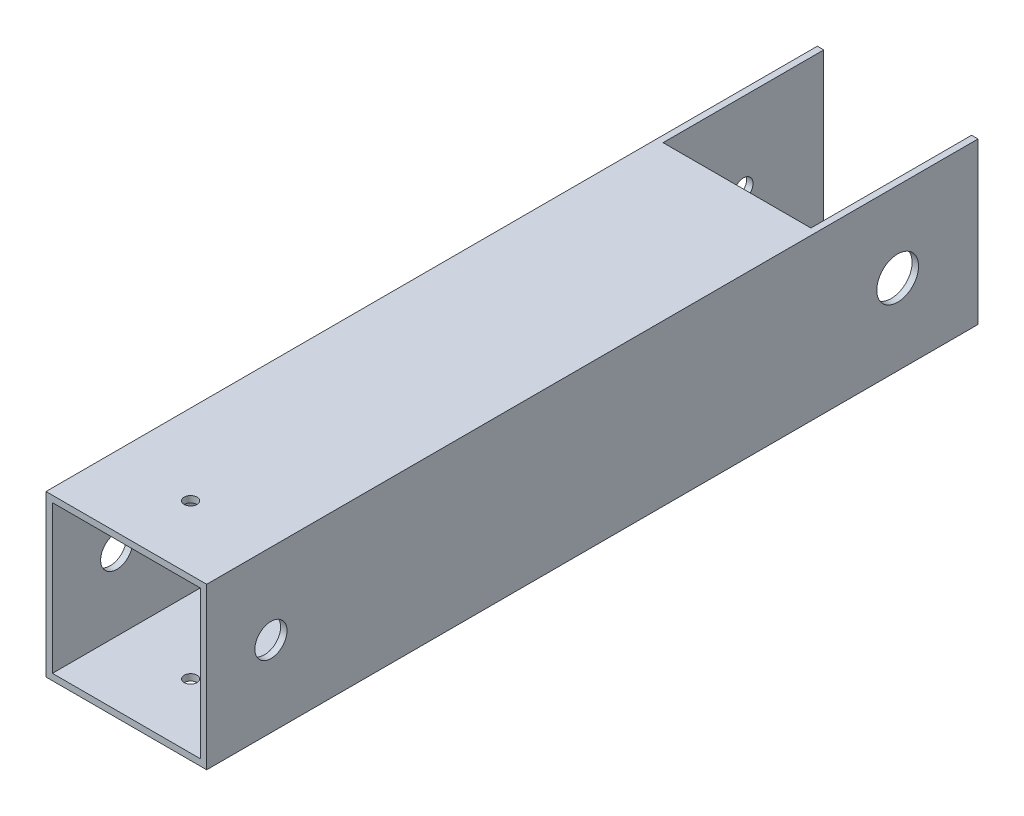
ISO-10303-21;
HEADER;
FILE_DESCRIPTION(('STEP AP214'),'2;1');
FILE_NAME('part.step','',(''),(''),'','','');
FILE_SCHEMA(('AUTOMOTIVE_DESIGN { 1 0 10303 214 1 1 1 1 }'));
ENDSEC;
DATA;
#1=APPLICATION_CONTEXT('core data for automotive mechanical design processes');
#2=APPLICATION_PROTOCOL_DEFINITION('international standard','automotive_design',2000,#1);
#3=PRODUCT_CONTEXT('',#1,'mechanical');
#4=PRODUCT('Part','Part','',(#3));
#5=PRODUCT_RELATED_PRODUCT_CATEGORY('part','',(#4));
#6=PRODUCT_DEFINITION_FORMATION('','',#4);
#7=PRODUCT_DEFINITION_CONTEXT('part definition',#1,'design');
#8=PRODUCT_DEFINITION('design','',#6,#7);
#9=PRODUCT_DEFINITION_SHAPE('','',#8);
#10=(LENGTH_UNIT() NAMED_UNIT(*) SI_UNIT(.MILLI.,.METRE.));
#11=(NAMED_UNIT(*) PLANE_ANGLE_UNIT() SI_UNIT($,.RADIAN.));
#12=(NAMED_UNIT(*) SI_UNIT($,.STERADIAN.) SOLID_ANGLE_UNIT());
#13=UNCERTAINTY_MEASURE_WITH_UNIT(LENGTH_MEASURE(1.E-05),#10,'distance_accuracy_value','');
#14=(GEOMETRIC_REPRESENTATION_CONTEXT(3) GLOBAL_UNCERTAINTY_ASSIGNED_CONTEXT((#13)) GLOBAL_UNIT_ASSIGNED_CONTEXT((#10,
#11,#12)) REPRESENTATION_CONTEXT('',''));
#15=CARTESIAN_POINT('',(0.,0.,0.));
#16=DIRECTION('',(0.,0.,1.));
#17=DIRECTION('',(1.,0.,0.));
#18=AXIS2_PLACEMENT_3D('',#15,#16,#17);
#19=CARTESIAN_POINT('',(-25.,-25.0000000000001,-240.));
#20=DIRECTION('',(-1.,0.,0.));
#21=DIRECTION('',(0.,0.,1.));
#22=AXIS2_PLACEMENT_3D('',#19,#20,#21);
#23=PLANE('',#22);
#24=CARTESIAN_POINT('',(-25.,0.,-215.));
#25=DIRECTION('',(-1.,0.,0.));
#26=DIRECTION('',(0.,0.,1.));
#27=AXIS2_PLACEMENT_3D('',#24,#25,#26);
#28=CIRCLE('',#27,2.99999999999999);
#29=CARTESIAN_POINT('',(-25.,0.,-212.));
#30=VERTEX_POINT('',#29);
#31=EDGE_CURVE('E187',#30,#30,#28,.T.);
#32=ORIENTED_EDGE('',*,*,#31,.F.);
#33=EDGE_LOOP('',(#32));
#34=FACE_BOUND('',#33,.T.);
#35=CARTESIAN_POINT('',(-25.,0.,-20.));
#36=DIRECTION('',(-1.,0.,0.));
#37=DIRECTION('',(0.,0.,1.));
#38=AXIS2_PLACEMENT_3D('',#35,#36,#37);
#39=CIRCLE('',#38,5.);
#40=CARTESIAN_POINT('',(-25.,0.,-15.));
#41=VERTEX_POINT('',#40);
#42=EDGE_CURVE('E186',#41,#41,#39,.T.);
#43=ORIENTED_EDGE('',*,*,#42,.F.);
#44=EDGE_LOOP('',(#43));
#45=FACE_BOUND('',#44,.T.);
#46=DIRECTION('',(0.,-1.,0.));
#47=VECTOR('',#46,1.);
#48=CARTESIAN_POINT('',(-25.,-25.0000000000001,0.));
#49=LINE('',#48,#47);
#50=CARTESIAN_POINT('',(-25.,25.0000000000001,0.));
#51=VERTEX_POINT('',#50);
#52=CARTESIAN_POINT('',(-25.,-25.0000000000001,0.));
#53=VERTEX_POINT('',#52);
#54=EDGE_CURVE('E286',#51,#53,#49,.T.);
#55=ORIENTED_EDGE('',*,*,#54,.F.);
#56=DIRECTION('',(0.,0.,1.));
#57=VECTOR('',#56,1.);
#58=CARTESIAN_POINT('',(-25.,25.0000000000001,-240.));
#59=LINE('',#58,#57);
#60=CARTESIAN_POINT('',(-25.,25.0000000000001,-240.));
#61=VERTEX_POINT('',#60);
#62=EDGE_CURVE('E294',#61,#51,#59,.T.);
#63=ORIENTED_EDGE('',*,*,#62,.F.);
#64=DIRECTION('',(0.,-1.,0.));
#65=VECTOR('',#64,1.);
#66=CARTESIAN_POINT('',(-25.,-25.0000000000001,-240.));
#67=LINE('',#66,#65);
#68=CARTESIAN_POINT('',(-25.,-25.0000000000001,-240.));
#69=VERTEX_POINT('',#68);
#70=EDGE_CURVE('E273',#61,#69,#67,.T.);
#71=ORIENTED_EDGE('',*,*,#70,.T.);
#72=DIRECTION('',(0.,0.,1.));
#73=VECTOR('',#72,1.);
#74=CARTESIAN_POINT('',(-25.,-25.0000000000001,-240.));
#75=LINE('',#74,#73);
#76=EDGE_CURVE('E292',#69,#53,#75,.T.);
#77=ORIENTED_EDGE('',*,*,#76,.T.);
#78=EDGE_LOOP('',(#55,#63,#71,#77));
#79=FACE_BOUND('',#78,.T.);
#80=DIRECTION('',(0.,1.,0.));
#81=VECTOR('',#80,1.);
#82=CARTESIAN_POINT('',(-25.,-23.0000000000001,-175.));
#83=LINE('',#82,#81);
#84=CARTESIAN_POINT('',(-25.,-23.0000000000001,-175.));
#85=VERTEX_POINT('',#84);
#86=CARTESIAN_POINT('',(-25.,23.0000000000001,-175.));
#87=VERTEX_POINT('',#86);
#88=EDGE_CURVE('E170',#85,#87,#83,.T.);
#89=ORIENTED_EDGE('',*,*,#88,.T.);
#90=DIRECTION('',(0.,0.,1.));
#91=VECTOR('',#90,1.);
#92=CARTESIAN_POINT('',(-25.,23.0000000000001,-175.));
#93=LINE('',#92,#91);
#94=CARTESIAN_POINT('',(-25.,23.,-55.));
#95=VERTEX_POINT('',#94);
#96=EDGE_CURVE('E53',#87,#95,#93,.T.);
#97=ORIENTED_EDGE('',*,*,#96,.T.);
#98=DIRECTION('',(0.,-1.,0.));
#99=VECTOR('',#98,1.);
#100=CARTESIAN_POINT('',(-25.,23.,-55.));
#101=LINE('',#100,#99);
#102=CARTESIAN_POINT('',(-25.,-23.0000000000001,-55.));
#103=VERTEX_POINT('',#102);
#104=EDGE_CURVE('E161',#95,#103,#101,.T.);
#105=ORIENTED_EDGE('',*,*,#104,.T.);
#106=DIRECTION('',(0.,0.,-1.));
#107=VECTOR('',#106,1.);
#108=CARTESIAN_POINT('',(-25.,-23.0000000000001,-55.));
#109=LINE('',#108,#107);
#110=EDGE_CURVE('E167',#103,#85,#109,.T.);
#111=ORIENTED_EDGE('',*,*,#110,.T.);
#112=EDGE_LOOP('',(#89,#97,#105,#111));
#113=FACE_BOUND('',#112,.T.);
#114=ADVANCED_FACE('F37',(#34,#45,#79,#113),#23,.T.);
#115=CARTESIAN_POINT('',(-23.,-23.0000000000001,-240.));
#116=DIRECTION('',(-1.,0.,0.));
#117=DIRECTION('',(0.,0.,1.));
#118=AXIS2_PLACEMENT_3D('',#115,#116,#117);
#119=PLANE('',#118);
#120=CARTESIAN_POINT('',(-23.,0.,-20.));
#121=DIRECTION('',(-1.,0.,0.));
#122=DIRECTION('',(0.,0.,1.));
#123=AXIS2_PLACEMENT_3D('',#120,#121,#122);
#124=CIRCLE('',#123,5.);
#125=CARTESIAN_POINT('',(-23.,0.,-15.));
#126=VERTEX_POINT('',#125);
#127=EDGE_CURVE('E191',#126,#126,#124,.F.);
#128=ORIENTED_EDGE('',*,*,#127,.F.);
#129=EDGE_LOOP('',(#128));
#130=FACE_BOUND('',#129,.T.);
#131=DIRECTION('',(0.,-1.,0.));
#132=VECTOR('',#131,1.);
#133=CARTESIAN_POINT('',(-23.,-23.0000000000002,-55.));
#134=LINE('',#133,#132);
#135=CARTESIAN_POINT('',(-23.,23.,-55.));
#136=VERTEX_POINT('',#135);
#137=CARTESIAN_POINT('',(-23.,-23.0000000000001,-55.));
#138=VERTEX_POINT('',#137);
#139=EDGE_CURVE('E184',#136,#138,#134,.T.);
#140=ORIENTED_EDGE('',*,*,#139,.F.);
#141=DIRECTION('',(0.,0.,1.));
#142=VECTOR('',#141,1.);
#143=CARTESIAN_POINT('',(-23.,23.0000000000001,-240.));
#144=LINE('',#143,#142);
#145=CARTESIAN_POINT('',(-23.,23.0000000000001,0.));
#146=VERTEX_POINT('',#145);
#147=EDGE_CURVE('E154',#136,#146,#144,.T.);
#148=ORIENTED_EDGE('',*,*,#147,.T.);
#149=DIRECTION('',(0.,-1.,0.));
#150=VECTOR('',#149,1.);
#151=CARTESIAN_POINT('',(-23.,-23.0000000000001,0.));
#152=LINE('',#151,#150);
#153=CARTESIAN_POINT('',(-23.,-23.0000000000001,0.));
#154=VERTEX_POINT('',#153);
#155=EDGE_CURVE('E249',#146,#154,#152,.T.);
#156=ORIENTED_EDGE('',*,*,#155,.T.);
#157=DIRECTION('',(0.,0.,1.));
#158=VECTOR('',#157,1.);
#159=CARTESIAN_POINT('',(-23.,-23.0000000000001,-240.));
#160=LINE('',#159,#158);
#161=EDGE_CURVE('E260',#138,#154,#160,.T.);
#162=ORIENTED_EDGE('',*,*,#161,.F.);
#163=EDGE_LOOP('',(#140,#148,#156,#162));
#164=FACE_BOUND('',#163,.T.);
#165=ADVANCED_FACE('F336',(#130,#164),#119,.F.);
#166=CARTESIAN_POINT('',(-23.,0.,-215.));
#167=DIRECTION('',(-1.,0.,0.));
#168=DIRECTION('',(0.,0.,1.));
#169=AXIS2_PLACEMENT_3D('',#166,#167,#168);
#170=CIRCLE('',#169,2.99999999999999);
#171=CARTESIAN_POINT('',(-23.,0.,-212.));
#172=VERTEX_POINT('',#171);
#173=EDGE_CURVE('E190',#172,#172,#170,.F.);
#174=ORIENTED_EDGE('',*,*,#173,.F.);
#175=EDGE_LOOP('',(#174));
#176=FACE_BOUND('',#175,.T.);
#177=DIRECTION('',(0.,1.,0.));
#178=VECTOR('',#177,1.);
#179=CARTESIAN_POINT('',(-23.,-23.0000000000001,-175.));
#180=LINE('',#179,#178);
#181=CARTESIAN_POINT('',(-23.,-23.0000000000001,-175.));
#182=VERTEX_POINT('',#181);
#183=CARTESIAN_POINT('',(-23.,23.0000000000001,-175.));
#184=VERTEX_POINT('',#183);
#185=EDGE_CURVE('E157',#182,#184,#180,.T.);
#186=ORIENTED_EDGE('',*,*,#185,.F.);
#187=CARTESIAN_POINT('',(-23.,-23.0000000000001,-190.));
#188=VERTEX_POINT('',#187);
#189=EDGE_CURVE('E257',#188,#182,#160,.T.);
#190=ORIENTED_EDGE('',*,*,#189,.F.);
#191=DIRECTION('',(0.,1.,0.));
#192=VECTOR('',#191,1.);
#193=CARTESIAN_POINT('',(-23.,-25.0000000000001,-190.));
#194=LINE('',#193,#192);
#195=CARTESIAN_POINT('',(-23.,-25.0000000000001,-190.));
#196=VERTEX_POINT('',#195);
#197=EDGE_CURVE('E234',#196,#188,#194,.T.);
#198=ORIENTED_EDGE('',*,*,#197,.F.);
#199=DIRECTION('',(0.,0.,1.));
#200=VECTOR('',#199,1.);
#201=CARTESIAN_POINT('',(-23.,-25.0000000000001,-190.));
#202=LINE('',#201,#200);
#203=CARTESIAN_POINT('',(-23.,-25.0000000000001,-240.));
#204=VERTEX_POINT('',#203);
#205=EDGE_CURVE('E211',#204,#196,#202,.T.);
#206=ORIENTED_EDGE('',*,*,#205,.F.);
#207=DIRECTION('',(0.,-1.,0.));
#208=VECTOR('',#207,1.);
#209=CARTESIAN_POINT('',(-23.,-23.0000000000001,-240.));
#210=LINE('',#209,#208);
#211=CARTESIAN_POINT('',(-23.,25.0000000000001,-240.));
#212=VERTEX_POINT('',#211);
#213=EDGE_CURVE('E241',#212,#204,#210,.T.);
#214=ORIENTED_EDGE('',*,*,#213,.F.);
#215=DIRECTION('',(0.,0.,1.));
#216=VECTOR('',#215,1.);
#217=CARTESIAN_POINT('',(-23.,25.0000000000001,-190.));
#218=LINE('',#217,#216);
#219=CARTESIAN_POINT('',(-23.,25.0000000000001,-190.));
#220=VERTEX_POINT('',#219);
#221=EDGE_CURVE('E206',#212,#220,#218,.T.);
#222=ORIENTED_EDGE('',*,*,#221,.T.);
#223=CARTESIAN_POINT('',(-23.,23.0000000000001,-190.));
#224=VERTEX_POINT('',#223);
#225=EDGE_CURVE('E221',#224,#220,#194,.T.);
#226=ORIENTED_EDGE('',*,*,#225,.F.);
#227=EDGE_CURVE('E261',#224,#184,#144,.T.);
#228=ORIENTED_EDGE('',*,*,#227,.T.);
#229=EDGE_LOOP('',(#186,#190,#198,#206,#214,#222,#226,#228));
#230=FACE_BOUND('',#229,.T.);
#231=ADVANCED_FACE('F327',(#176,#230),#119,.F.);
#232=CARTESIAN_POINT('',(0.,0.,-240.));
#233=DIRECTION('',(0.,0.,-1.));
#234=DIRECTION('',(-1.,0.,0.));
#235=AXIS2_PLACEMENT_3D('',#232,#233,#234);
#236=PLANE('',#235);
#237=ORIENTED_EDGE('',*,*,#213,.T.);
#238=DIRECTION('',(1.,0.,0.));
#239=VECTOR('',#238,1.);
#240=CARTESIAN_POINT('',(-25.,-25.0000000000001,-240.));
#241=LINE('',#240,#239);
#242=EDGE_CURVE('E277',#69,#204,#241,.T.);
#243=ORIENTED_EDGE('',*,*,#242,.F.);
#244=ORIENTED_EDGE('',*,*,#70,.F.);
#245=DIRECTION('',(-1.,0.,0.));
#246=VECTOR('',#245,1.);
#247=CARTESIAN_POINT('',(-25.,25.0000000000001,-240.));
#248=LINE('',#247,#246);
#249=EDGE_CURVE('E268',#212,#61,#248,.T.);
#250=ORIENTED_EDGE('',*,*,#249,.F.);
#251=EDGE_LOOP('',(#237,#243,#244,#250));
#252=FACE_BOUND('',#251,.T.);
#253=ADVANCED_FACE('F332',(#252),#236,.T.);
#254=CARTESIAN_POINT('',(25.,-25.0000000000001,-240.));
#255=DIRECTION('',(1.,0.,0.));
#256=DIRECTION('',(0.,0.,-1.));
#257=AXIS2_PLACEMENT_3D('',#254,#255,#256);
#258=PLANE('',#257);
#259=CARTESIAN_POINT('',(25.,0.,-215.));
#260=DIRECTION('',(1.,0.,0.));
#261=DIRECTION('',(0.,0.,-1.));
#262=AXIS2_PLACEMENT_3D('',#259,#260,#261);
#263=CIRCLE('',#262,6.50000000000002);
#264=CARTESIAN_POINT('',(25.,0.,-221.5));
#265=VERTEX_POINT('',#264);
#266=EDGE_CURVE('E199',#265,#265,#263,.T.);
#267=ORIENTED_EDGE('',*,*,#266,.F.);
#268=EDGE_LOOP('',(#267));
#269=FACE_BOUND('',#268,.T.);
#270=CARTESIAN_POINT('',(25.,0.,-20.));
#271=DIRECTION('',(1.,0.,0.));
#272=DIRECTION('',(0.,0.,-1.));
#273=AXIS2_PLACEMENT_3D('',#270,#271,#272);
#274=CIRCLE('',#273,5.);
#275=CARTESIAN_POINT('',(25.,0.,-25.));
#276=VERTEX_POINT('',#275);
#277=EDGE_CURVE('E194',#276,#276,#274,.T.);
#278=ORIENTED_EDGE('',*,*,#277,.F.);
#279=EDGE_LOOP('',(#278));
#280=FACE_BOUND('',#279,.T.);
#281=DIRECTION('',(0.,1.,0.));
#282=VECTOR('',#281,1.);
#283=CARTESIAN_POINT('',(25.,-25.0000000000001,0.));
#284=LINE('',#283,#282);
#285=CARTESIAN_POINT('',(25.,-25.0000000000001,0.));
#286=VERTEX_POINT('',#285);
#287=CARTESIAN_POINT('',(25.,25.0000000000001,0.));
#288=VERTEX_POINT('',#287);
#289=EDGE_CURVE('E256',#286,#288,#284,.T.);
#290=ORIENTED_EDGE('',*,*,#289,.F.);
#291=DIRECTION('',(0.,0.,1.));
#292=VECTOR('',#291,1.);
#293=CARTESIAN_POINT('',(25.,-25.0000000000001,-240.));
#294=LINE('',#293,#292);
#295=CARTESIAN_POINT('',(25.,-25.0000000000001,-240.));
#296=VERTEX_POINT('',#295);
#297=EDGE_CURVE('E46',#296,#286,#294,.T.);
#298=ORIENTED_EDGE('',*,*,#297,.F.);
#299=DIRECTION('',(0.,1.,0.));
#300=VECTOR('',#299,1.);
#301=CARTESIAN_POINT('',(25.,-25.0000000000001,-240.));
#302=LINE('',#301,#300);
#303=CARTESIAN_POINT('',(25.,25.0000000000001,-240.));
#304=VERTEX_POINT('',#303);
#305=EDGE_CURVE('E265',#296,#304,#302,.T.);
#306=ORIENTED_EDGE('',*,*,#305,.T.);
#307=DIRECTION('',(0.,0.,1.));
#308=VECTOR('',#307,1.);
#309=CARTESIAN_POINT('',(25.,25.0000000000001,-240.));
#310=LINE('',#309,#308);
#311=EDGE_CURVE('E280',#304,#288,#310,.T.);
#312=ORIENTED_EDGE('',*,*,#311,.T.);
#313=EDGE_LOOP('',(#290,#298,#306,#312));
#314=FACE_BOUND('',#313,.T.);
#315=ADVANCED_FACE('F39',(#269,#280,#314),#258,.T.);
#316=CARTESIAN_POINT('',(-25.,-25.0000000000001,-240.));
#317=DIRECTION('',(0.,-1.,0.));
#318=DIRECTION('',(0.,0.,-1.));
#319=AXIS2_PLACEMENT_3D('',#316,#317,#318);
#320=PLANE('',#319);
#321=CARTESIAN_POINT('',(0.,-25.0000000000001,-20.));
#322=DIRECTION('',(0.,1.,0.));
#323=DIRECTION('',(0.,0.,1.));
#324=AXIS2_PLACEMENT_3D('',#321,#322,#323);
#325=CIRCLE('',#324,2.);
#326=CARTESIAN_POINT('',(0.,-25.0000000000001,-18.));
#327=VERTEX_POINT('',#326);
#328=EDGE_CURVE('E361',#327,#327,#325,.T.);
#329=ORIENTED_EDGE('',*,*,#328,.T.);
#330=EDGE_LOOP('',(#329));
#331=FACE_BOUND('',#330,.T.);
#332=ORIENTED_EDGE('',*,*,#205,.T.);
#333=DIRECTION('',(1.,0.,0.));
#334=VECTOR('',#333,1.);
#335=CARTESIAN_POINT('',(23.,-25.0000000000001,-190.));
#336=LINE('',#335,#334);
#337=CARTESIAN_POINT('',(23.,-25.0000000000001,-190.));
#338=VERTEX_POINT('',#337);
#339=EDGE_CURVE('E214',#196,#338,#336,.T.);
#340=ORIENTED_EDGE('',*,*,#339,.T.);
#341=DIRECTION('',(0.,0.,-1.));
#342=VECTOR('',#341,1.);
#343=CARTESIAN_POINT('',(23.,-25.0000000000001,-190.));
#344=LINE('',#343,#342);
#345=CARTESIAN_POINT('',(23.,-25.0000000000001,-240.));
#346=VERTEX_POINT('',#345);
#347=EDGE_CURVE('E218',#338,#346,#344,.T.);
#348=ORIENTED_EDGE('',*,*,#347,.T.);
#349=EDGE_CURVE('E276',#346,#296,#241,.T.);
#350=ORIENTED_EDGE('',*,*,#349,.T.);
#351=ORIENTED_EDGE('',*,*,#297,.T.);
#352=DIRECTION('',(1.,0.,0.));
#353=VECTOR('',#352,1.);
#354=CARTESIAN_POINT('',(-25.,-25.0000000000001,0.));
#355=LINE('',#354,#353);
#356=EDGE_CURVE('E269',#53,#286,#355,.T.);
#357=ORIENTED_EDGE('',*,*,#356,.F.);
#358=ORIENTED_EDGE('',*,*,#76,.F.);
#359=ORIENTED_EDGE('',*,*,#242,.T.);
#360=EDGE_LOOP('',(#332,#340,#348,#350,#351,#357,#358,#359));
#361=FACE_BOUND('',#360,.T.);
#362=ADVANCED_FACE('F311',(#331,#361),#320,.T.);
#363=CARTESIAN_POINT('',(-25.,25.0000000000001,-240.));
#364=DIRECTION('',(0.,1.,0.));
#365=DIRECTION('',(0.,0.,1.));
#366=AXIS2_PLACEMENT_3D('',#363,#364,#365);
#367=PLANE('',#366);
#368=CARTESIAN_POINT('',(0.,25.0000000000001,-20.));
#369=DIRECTION('',(0.,1.,0.));
#370=DIRECTION('',(0.,0.,1.));
#371=AXIS2_PLACEMENT_3D('',#368,#369,#370);
#372=CIRCLE('',#371,2.);
#373=CARTESIAN_POINT('',(0.,25.0000000000001,-18.));
#374=VERTEX_POINT('',#373);
#375=EDGE_CURVE('E359',#374,#374,#372,.T.);
#376=ORIENTED_EDGE('',*,*,#375,.F.);
#377=EDGE_LOOP('',(#376));
#378=FACE_BOUND('',#377,.T.);
#379=ORIENTED_EDGE('',*,*,#221,.F.);
#380=ORIENTED_EDGE('',*,*,#249,.T.);
#381=ORIENTED_EDGE('',*,*,#62,.T.);
#382=DIRECTION('',(-1.,0.,0.));
#383=VECTOR('',#382,1.);
#384=CARTESIAN_POINT('',(-25.,25.0000000000001,0.));
#385=LINE('',#384,#383);
#386=EDGE_CURVE('E283',#288,#51,#385,.T.);
#387=ORIENTED_EDGE('',*,*,#386,.F.);
#388=ORIENTED_EDGE('',*,*,#311,.F.);
#389=CARTESIAN_POINT('',(23.,25.0000000000001,-240.));
#390=VERTEX_POINT('',#389);
#391=EDGE_CURVE('E270',#304,#390,#248,.T.);
#392=ORIENTED_EDGE('',*,*,#391,.T.);
#393=DIRECTION('',(0.,0.,-1.));
#394=VECTOR('',#393,1.);
#395=CARTESIAN_POINT('',(23.,25.0000000000001,-190.));
#396=LINE('',#395,#394);
#397=CARTESIAN_POINT('',(23.,25.0000000000001,-190.));
#398=VERTEX_POINT('',#397);
#399=EDGE_CURVE('E215',#398,#390,#396,.T.);
#400=ORIENTED_EDGE('',*,*,#399,.F.);
#401=DIRECTION('',(1.,0.,0.));
#402=VECTOR('',#401,1.);
#403=CARTESIAN_POINT('',(23.,25.0000000000001,-190.));
#404=LINE('',#403,#402);
#405=EDGE_CURVE('E224',#220,#398,#404,.T.);
#406=ORIENTED_EDGE('',*,*,#405,.F.);
#407=EDGE_LOOP('',(#379,#380,#381,#387,#388,#392,#400,#406));
#408=FACE_BOUND('',#407,.T.);
#409=ADVANCED_FACE('F304',(#378,#408),#367,.T.);
#410=DIRECTION('',(0.,1.,0.));
#411=VECTOR('',#410,1.);
#412=CARTESIAN_POINT('',(23.,-23.0000000000001,-240.));
#413=LINE('',#412,#411);
#414=EDGE_CURVE('E239',#346,#390,#413,.T.);
#415=ORIENTED_EDGE('',*,*,#414,.T.);
#416=ORIENTED_EDGE('',*,*,#391,.F.);
#417=ORIENTED_EDGE('',*,*,#305,.F.);
#418=ORIENTED_EDGE('',*,*,#349,.F.);
#419=EDGE_LOOP('',(#415,#416,#417,#418));
#420=FACE_BOUND('',#419,.T.);
#421=ADVANCED_FACE('F314',(#420),#236,.T.);
#422=CARTESIAN_POINT('',(0.,0.,0.));
#423=DIRECTION('',(0.,0.,-1.));
#424=DIRECTION('',(-1.,0.,0.));
#425=AXIS2_PLACEMENT_3D('',#422,#423,#424);
#426=PLANE('',#425);
#427=DIRECTION('',(-1.,0.,0.));
#428=VECTOR('',#427,1.);
#429=CARTESIAN_POINT('',(-23.,23.0000000000001,0.));
#430=LINE('',#429,#428);
#431=CARTESIAN_POINT('',(23.,23.0000000000001,0.));
#432=VERTEX_POINT('',#431);
#433=EDGE_CURVE('E247',#432,#146,#430,.T.);
#434=ORIENTED_EDGE('',*,*,#433,.F.);
#435=DIRECTION('',(0.,1.,0.));
#436=VECTOR('',#435,1.);
#437=CARTESIAN_POINT('',(23.,-23.0000000000001,0.));
#438=LINE('',#437,#436);
#439=CARTESIAN_POINT('',(23.,-23.0000000000001,0.));
#440=VERTEX_POINT('',#439);
#441=EDGE_CURVE('E238',#440,#432,#438,.T.);
#442=ORIENTED_EDGE('',*,*,#441,.F.);
#443=DIRECTION('',(1.,0.,0.));
#444=VECTOR('',#443,1.);
#445=CARTESIAN_POINT('',(-23.,-23.0000000000001,0.));
#446=LINE('',#445,#444);
#447=EDGE_CURVE('E242',#154,#440,#446,.T.);
#448=ORIENTED_EDGE('',*,*,#447,.F.);
#449=ORIENTED_EDGE('',*,*,#155,.F.);
#450=EDGE_LOOP('',(#434,#442,#448,#449));
#451=FACE_BOUND('',#450,.T.);
#452=ORIENTED_EDGE('',*,*,#289,.T.);
#453=ORIENTED_EDGE('',*,*,#386,.T.);
#454=ORIENTED_EDGE('',*,*,#54,.T.);
#455=ORIENTED_EDGE('',*,*,#356,.T.);
#456=EDGE_LOOP('',(#452,#453,#454,#455));
#457=FACE_BOUND('',#456,.T.);
#458=ADVANCED_FACE('F308',(#451,#457),#426,.F.);
#459=CARTESIAN_POINT('',(23.,-23.0000000000001,-240.));
#460=DIRECTION('',(1.,0.,0.));
#461=DIRECTION('',(0.,0.,-1.));
#462=AXIS2_PLACEMENT_3D('',#459,#460,#461);
#463=PLANE('',#462);
#464=DIRECTION('',(0.,0.,1.));
#465=VECTOR('',#464,1.);
#466=CARTESIAN_POINT('',(23.,-23.0000000000001,-240.));
#467=LINE('',#466,#465);
#468=CARTESIAN_POINT('',(23.,-23.0000000000001,-190.));
#469=VERTEX_POINT('',#468);
#470=EDGE_CURVE('E254',#469,#440,#467,.T.);
#471=ORIENTED_EDGE('',*,*,#470,.T.);
#472=ORIENTED_EDGE('',*,*,#441,.T.);
#473=DIRECTION('',(0.,0.,1.));
#474=VECTOR('',#473,1.);
#475=CARTESIAN_POINT('',(23.,23.0000000000001,-240.));
#476=LINE('',#475,#474);
#477=CARTESIAN_POINT('',(23.,23.0000000000001,-190.));
#478=VERTEX_POINT('',#477);
#479=EDGE_CURVE('E244',#478,#432,#476,.T.);
#480=ORIENTED_EDGE('',*,*,#479,.F.);
#481=DIRECTION('',(0.,1.,0.));
#482=VECTOR('',#481,1.);
#483=CARTESIAN_POINT('',(23.,-25.0000000000001,-190.));
#484=LINE('',#483,#482);
#485=EDGE_CURVE('E233',#478,#398,#484,.T.);
#486=ORIENTED_EDGE('',*,*,#485,.T.);
#487=ORIENTED_EDGE('',*,*,#399,.T.);
#488=ORIENTED_EDGE('',*,*,#414,.F.);
#489=ORIENTED_EDGE('',*,*,#347,.F.);
#490=EDGE_CURVE('E229',#338,#469,#484,.T.);
#491=ORIENTED_EDGE('',*,*,#490,.T.);
#492=EDGE_LOOP('',(#471,#472,#480,#486,#487,#488,#489,#491));
#493=FACE_BOUND('',#492,.T.);
#494=CARTESIAN_POINT('',(23.,0.,-215.));
#495=DIRECTION('',(1.,0.,0.));
#496=DIRECTION('',(0.,0.,-1.));
#497=AXIS2_PLACEMENT_3D('',#494,#495,#496);
#498=CIRCLE('',#497,6.50000000000002);
#499=CARTESIAN_POINT('',(23.,0.,-221.5));
#500=VERTEX_POINT('',#499);
#501=EDGE_CURVE('E202',#500,#500,#498,.F.);
#502=ORIENTED_EDGE('',*,*,#501,.F.);
#503=EDGE_LOOP('',(#502));
#504=FACE_BOUND('',#503,.T.);
#505=CARTESIAN_POINT('',(23.,0.,-20.));
#506=DIRECTION('',(1.,0.,0.));
#507=DIRECTION('',(0.,0.,-1.));
#508=AXIS2_PLACEMENT_3D('',#505,#506,#507);
#509=CIRCLE('',#508,5.);
#510=CARTESIAN_POINT('',(23.,0.,-25.));
#511=VERTEX_POINT('',#510);
#512=EDGE_CURVE('E203',#511,#511,#509,.F.);
#513=ORIENTED_EDGE('',*,*,#512,.F.);
#514=EDGE_LOOP('',(#513));
#515=FACE_BOUND('',#514,.T.);
#516=ADVANCED_FACE('F318',(#493,#504,#515),#463,.F.);
#517=CARTESIAN_POINT('',(-23.,-23.0000000000001,-240.));
#518=DIRECTION('',(0.,-1.,0.));
#519=DIRECTION('',(0.,0.,-1.));
#520=AXIS2_PLACEMENT_3D('',#517,#518,#519);
#521=PLANE('',#520);
#522=CARTESIAN_POINT('',(0.,-23.0000000000001,-20.));
#523=DIRECTION('',(0.,-1.,0.));
#524=DIRECTION('',(0.,0.,-1.));
#525=AXIS2_PLACEMENT_3D('',#522,#523,#524);
#526=CIRCLE('',#525,2.);
#527=CARTESIAN_POINT('',(0.,-23.0000000000001,-22.));
#528=VERTEX_POINT('',#527);
#529=EDGE_CURVE('E171',#528,#528,#526,.T.);
#530=ORIENTED_EDGE('',*,*,#529,.T.);
#531=EDGE_LOOP('',(#530));
#532=FACE_BOUND('',#531,.T.);
#533=ORIENTED_EDGE('',*,*,#447,.T.);
#534=ORIENTED_EDGE('',*,*,#470,.F.);
#535=DIRECTION('',(-1.,0.,0.));
#536=VECTOR('',#535,1.);
#537=CARTESIAN_POINT('',(-23.,-23.0000000000001,-190.));
#538=LINE('',#537,#536);
#539=EDGE_CURVE('E232',#469,#188,#538,.T.);
#540=ORIENTED_EDGE('',*,*,#539,.T.);
#541=ORIENTED_EDGE('',*,*,#189,.T.);
#542=DIRECTION('',(-1.,0.,0.));
#543=VECTOR('',#542,1.);
#544=CARTESIAN_POINT('',(23.,-23.0000000000001,-175.));
#545=LINE('',#544,#543);
#546=EDGE_CURVE('E61',#182,#85,#545,.T.);
#547=ORIENTED_EDGE('',*,*,#546,.T.);
#548=ORIENTED_EDGE('',*,*,#110,.F.);
#549=DIRECTION('',(-1.,0.,0.));
#550=VECTOR('',#549,1.);
#551=CARTESIAN_POINT('',(23.,-23.0000000000001,-55.));
#552=LINE('',#551,#550);
#553=EDGE_CURVE('E158',#138,#103,#552,.T.);
#554=ORIENTED_EDGE('',*,*,#553,.F.);
#555=ORIENTED_EDGE('',*,*,#161,.T.);
#556=EDGE_LOOP('',(#533,#534,#540,#541,#547,#548,#554,#555));
#557=FACE_BOUND('',#556,.T.);
#558=ADVANCED_FACE('F403',(#532,#557),#521,.F.);
#559=CARTESIAN_POINT('',(-23.,23.0000000000001,-240.));
#560=DIRECTION('',(0.,1.,0.));
#561=DIRECTION('',(0.,0.,1.));
#562=AXIS2_PLACEMENT_3D('',#559,#560,#561);
#563=PLANE('',#562);
#564=CARTESIAN_POINT('',(0.,23.0000000000001,-20.));
#565=DIRECTION('',(0.,1.,0.));
#566=DIRECTION('',(0.,0.,1.));
#567=AXIS2_PLACEMENT_3D('',#564,#565,#566);
#568=CIRCLE('',#567,2.);
#569=CARTESIAN_POINT('',(0.,23.0000000000001,-18.));
#570=VERTEX_POINT('',#569);
#571=EDGE_CURVE('E41',#570,#570,#568,.T.);
#572=ORIENTED_EDGE('',*,*,#571,.T.);
#573=EDGE_LOOP('',(#572));
#574=FACE_BOUND('',#573,.T.);
#575=ORIENTED_EDGE('',*,*,#479,.T.);
#576=ORIENTED_EDGE('',*,*,#433,.T.);
#577=ORIENTED_EDGE('',*,*,#147,.F.);
#578=DIRECTION('',(-1.,0.,0.));
#579=VECTOR('',#578,1.);
#580=CARTESIAN_POINT('',(23.,23.,-55.));
#581=LINE('',#580,#579);
#582=EDGE_CURVE('E150',#136,#95,#581,.T.);
#583=ORIENTED_EDGE('',*,*,#582,.T.);
#584=ORIENTED_EDGE('',*,*,#96,.F.);
#585=DIRECTION('',(-1.,0.,0.));
#586=VECTOR('',#585,1.);
#587=CARTESIAN_POINT('',(23.,23.0000000000001,-175.));
#588=LINE('',#587,#586);
#589=EDGE_CURVE('E179',#184,#87,#588,.T.);
#590=ORIENTED_EDGE('',*,*,#589,.F.);
#591=ORIENTED_EDGE('',*,*,#227,.F.);
#592=DIRECTION('',(1.,0.,0.));
#593=VECTOR('',#592,1.);
#594=CARTESIAN_POINT('',(-23.,23.0000000000001,-190.));
#595=LINE('',#594,#593);
#596=EDGE_CURVE('E11',#224,#478,#595,.T.);
#597=ORIENTED_EDGE('',*,*,#596,.T.);
#598=EDGE_LOOP('',(#575,#576,#577,#583,#584,#590,#591,#597));
#599=FACE_BOUND('',#598,.T.);
#600=ADVANCED_FACE('F152',(#574,#599),#563,.F.);
#601=CARTESIAN_POINT('',(23.,-25.0000000000001,-190.));
#602=DIRECTION('',(0.,0.,1.));
#603=DIRECTION('',(1.,0.,0.));
#604=AXIS2_PLACEMENT_3D('',#601,#602,#603);
#605=PLANE('',#604);
#606=ORIENTED_EDGE('',*,*,#225,.T.);
#607=ORIENTED_EDGE('',*,*,#405,.T.);
#608=ORIENTED_EDGE('',*,*,#485,.F.);
#609=ORIENTED_EDGE('',*,*,#596,.F.);
#610=EDGE_LOOP('',(#606,#607,#608,#609));
#611=FACE_BOUND('',#610,.T.);
#612=ADVANCED_FACE('F323',(#611),#605,.F.);
#613=ORIENTED_EDGE('',*,*,#490,.F.);
#614=ORIENTED_EDGE('',*,*,#339,.F.);
#615=ORIENTED_EDGE('',*,*,#197,.T.);
#616=ORIENTED_EDGE('',*,*,#539,.F.);
#617=EDGE_LOOP('',(#613,#614,#615,#616));
#618=FACE_BOUND('',#617,.T.);
#619=ADVANCED_FACE('F398',(#618),#605,.F.);
#620=CARTESIAN_POINT('',(-25.001,0.,-20.));
#621=DIRECTION('',(1.,0.,0.));
#622=DIRECTION('',(0.,0.,-1.));
#623=AXIS2_PLACEMENT_3D('',#620,#621,#622);
#624=CYLINDRICAL_SURFACE('',#623,5.);
#625=ORIENTED_EDGE('',*,*,#277,.T.);
#626=EDGE_LOOP('',(#625));
#627=FACE_BOUND('',#626,.T.);
#628=ORIENTED_EDGE('',*,*,#512,.T.);
#629=EDGE_LOOP('',(#628));
#630=FACE_BOUND('',#629,.T.);
#631=ADVANCED_FACE('F394',(#627,#630),#624,.F.);
#632=CARTESIAN_POINT('',(-25.001,0.,-215.));
#633=DIRECTION('',(1.,0.,0.));
#634=DIRECTION('',(0.,0.,-1.));
#635=AXIS2_PLACEMENT_3D('',#632,#633,#634);
#636=CYLINDRICAL_SURFACE('',#635,6.50000000000002);
#637=ORIENTED_EDGE('',*,*,#266,.T.);
#638=EDGE_LOOP('',(#637));
#639=FACE_BOUND('',#638,.T.);
#640=ORIENTED_EDGE('',*,*,#501,.T.);
#641=EDGE_LOOP('',(#640));
#642=FACE_BOUND('',#641,.T.);
#643=ADVANCED_FACE('F390',(#639,#642),#636,.F.);
#644=CARTESIAN_POINT('',(25.001,0.,-20.));
#645=DIRECTION('',(-1.,0.,0.));
#646=DIRECTION('',(0.,0.,1.));
#647=AXIS2_PLACEMENT_3D('',#644,#645,#646);
#648=CYLINDRICAL_SURFACE('',#647,5.);
#649=ORIENTED_EDGE('',*,*,#42,.T.);
#650=EDGE_LOOP('',(#649));
#651=FACE_BOUND('',#650,.T.);
#652=ORIENTED_EDGE('',*,*,#127,.T.);
#653=EDGE_LOOP('',(#652));
#654=FACE_BOUND('',#653,.T.);
#655=ADVANCED_FACE('F386',(#651,#654),#648,.F.);
#656=CARTESIAN_POINT('',(25.001,0.,-215.));
#657=DIRECTION('',(-1.,0.,0.));
#658=DIRECTION('',(0.,0.,1.));
#659=AXIS2_PLACEMENT_3D('',#656,#657,#658);
#660=CYLINDRICAL_SURFACE('',#659,2.99999999999999);
#661=ORIENTED_EDGE('',*,*,#31,.T.);
#662=EDGE_LOOP('',(#661));
#663=FACE_BOUND('',#662,.T.);
#664=ORIENTED_EDGE('',*,*,#173,.T.);
#665=EDGE_LOOP('',(#664));
#666=FACE_BOUND('',#665,.T.);
#667=ADVANCED_FACE('F383',(#663,#666),#660,.F.);
#668=CARTESIAN_POINT('',(23.,23.,-55.));
#669=DIRECTION('',(0.,0.,-1.));
#670=DIRECTION('',(0.,1.,0.));
#671=AXIS2_PLACEMENT_3D('',#668,#669,#670);
#672=PLANE('',#671);
#673=ORIENTED_EDGE('',*,*,#139,.T.);
#674=ORIENTED_EDGE('',*,*,#553,.T.);
#675=ORIENTED_EDGE('',*,*,#104,.F.);
#676=ORIENTED_EDGE('',*,*,#582,.F.);
#677=EDGE_LOOP('',(#673,#674,#675,#676));
#678=FACE_BOUND('',#677,.T.);
#679=ADVANCED_FACE('F162',(#678),#672,.T.);
#680=CARTESIAN_POINT('',(23.,-23.0000000000001,-175.));
#681=DIRECTION('',(0.,0.,1.));
#682=DIRECTION('',(1.,0.,0.));
#683=AXIS2_PLACEMENT_3D('',#680,#681,#682);
#684=PLANE('',#683);
#685=ORIENTED_EDGE('',*,*,#185,.T.);
#686=ORIENTED_EDGE('',*,*,#589,.T.);
#687=ORIENTED_EDGE('',*,*,#88,.F.);
#688=ORIENTED_EDGE('',*,*,#546,.F.);
#689=EDGE_LOOP('',(#685,#686,#687,#688));
#690=FACE_BOUND('',#689,.T.);
#691=ADVANCED_FACE('F372',(#690),#684,.T.);
#692=CARTESIAN_POINT('',(0.,-25.0000000000001,-20.));
#693=DIRECTION('',(0.,1.,0.));
#694=DIRECTION('',(0.,0.,1.));
#695=AXIS2_PLACEMENT_3D('',#692,#693,#694);
#696=CYLINDRICAL_SURFACE('',#695,2.);
#697=ORIENTED_EDGE('',*,*,#375,.T.);
#698=EDGE_LOOP('',(#697));
#699=FACE_BOUND('',#698,.T.);
#700=ORIENTED_EDGE('',*,*,#571,.F.);
#701=EDGE_LOOP('',(#700));
#702=FACE_BOUND('',#701,.T.);
#703=ADVANCED_FACE('F369',(#699,#702),#696,.F.);
#704=ORIENTED_EDGE('',*,*,#328,.F.);
#705=EDGE_LOOP('',(#704));
#706=FACE_BOUND('',#705,.T.);
#707=ORIENTED_EDGE('',*,*,#529,.F.);
#708=EDGE_LOOP('',(#707));
#709=FACE_BOUND('',#708,.T.);
#710=ADVANCED_FACE('F371',(#706,#709),#696,.F.);
#711=CLOSED_SHELL('',(#114,#165,#231,#253,#315,#362,#409,#421,#458,#516,#558,#600,#612,#619,
#631,#643,#655,#667,#679,#691,#703,#710));
#712=MANIFOLD_SOLID_BREP('B2',#711);
#713=ADVANCED_BREP_SHAPE_REPRESENTATION('',(#18,#712),#14);
#714=SHAPE_DEFINITION_REPRESENTATION(#9,#713);
ENDSEC;
END-ISO-10303-21;
